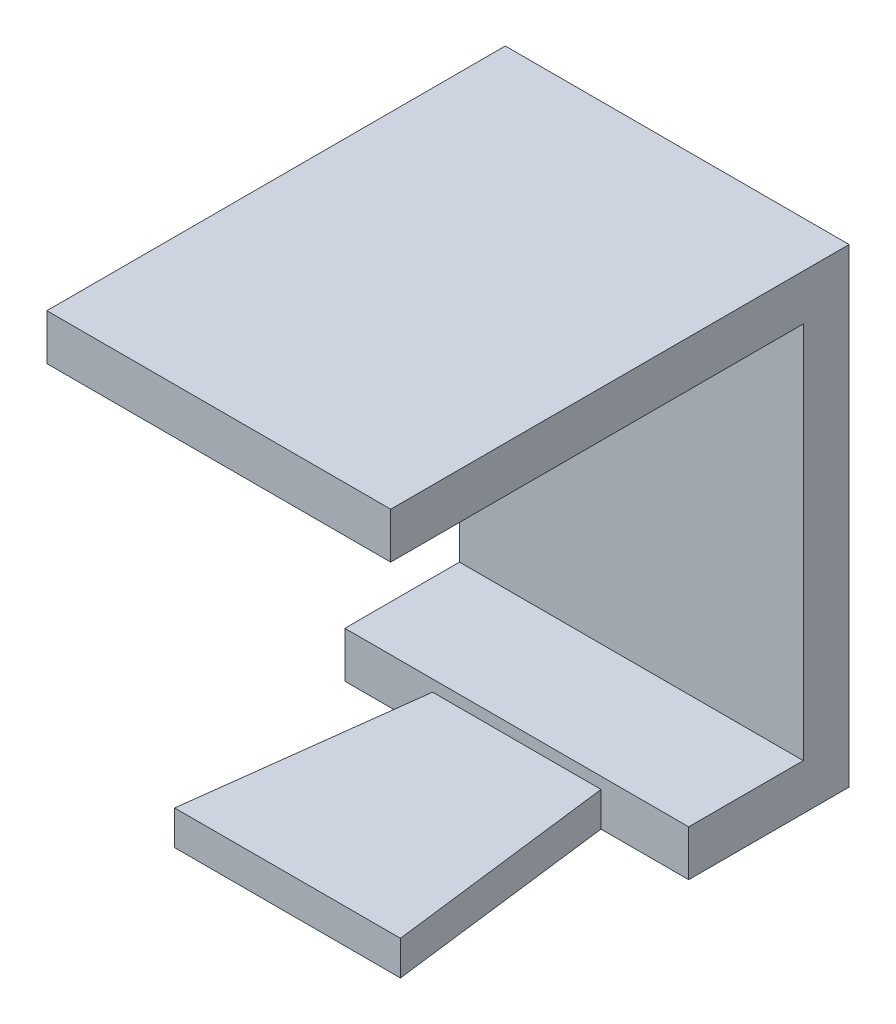
ISO-10303-21;
HEADER;
FILE_DESCRIPTION(('STEP AP214'),'2;1');
FILE_NAME('part.step','',(''),(''),'','','');
FILE_SCHEMA(('AUTOMOTIVE_DESIGN { 1 0 10303 214 1 1 1 1 }'));
ENDSEC;
DATA;
#1=APPLICATION_CONTEXT('core data for automotive mechanical design processes');
#2=APPLICATION_PROTOCOL_DEFINITION('international standard','automotive_design',2000,#1);
#3=PRODUCT_CONTEXT('',#1,'mechanical');
#4=PRODUCT('Part','Part','',(#3));
#5=PRODUCT_RELATED_PRODUCT_CATEGORY('part','',(#4));
#6=PRODUCT_DEFINITION_FORMATION('','',#4);
#7=PRODUCT_DEFINITION_CONTEXT('part definition',#1,'design');
#8=PRODUCT_DEFINITION('design','',#6,#7);
#9=PRODUCT_DEFINITION_SHAPE('','',#8);
#10=(LENGTH_UNIT() NAMED_UNIT(*) SI_UNIT(.MILLI.,.METRE.));
#11=(NAMED_UNIT(*) PLANE_ANGLE_UNIT() SI_UNIT($,.RADIAN.));
#12=(NAMED_UNIT(*) SI_UNIT($,.STERADIAN.) SOLID_ANGLE_UNIT());
#13=UNCERTAINTY_MEASURE_WITH_UNIT(LENGTH_MEASURE(1.E-05),#10,'distance_accuracy_value','');
#14=(GEOMETRIC_REPRESENTATION_CONTEXT(3) GLOBAL_UNCERTAINTY_ASSIGNED_CONTEXT((#13)) GLOBAL_UNIT_ASSIGNED_CONTEXT((#10,
#11,#12)) REPRESENTATION_CONTEXT('',''));
#15=CARTESIAN_POINT('',(0.,0.,0.));
#16=DIRECTION('',(0.,0.,1.));
#17=DIRECTION('',(1.,0.,0.));
#18=AXIS2_PLACEMENT_3D('',#15,#16,#17);
#19=CARTESIAN_POINT('',(0.,0.,4.));
#20=DIRECTION('',(1.,0.,0.));
#21=DIRECTION('',(0.,0.,-1.));
#22=AXIS2_PLACEMENT_3D('',#19,#20,#21);
#23=PLANE('',#22);
#24=DIRECTION('',(0.,-1.,0.));
#25=VECTOR('',#24,1.);
#26=CARTESIAN_POINT('',(0.,0.,0.));
#27=LINE('',#26,#25);
#28=CARTESIAN_POINT('',(0.,37.,0.));
#29=VERTEX_POINT('',#28);
#30=CARTESIAN_POINT('',(0.,-4.,0.));
#31=VERTEX_POINT('',#30);
#32=EDGE_CURVE('E213',#29,#31,#27,.T.);
#33=ORIENTED_EDGE('',*,*,#32,.T.);
#34=DIRECTION('',(0.,0.,-1.));
#35=VECTOR('',#34,1.);
#36=CARTESIAN_POINT('',(0.,-4.,0.));
#37=LINE('',#36,#35);
#38=CARTESIAN_POINT('',(0.,-4.,14.));
#39=VERTEX_POINT('',#38);
#40=EDGE_CURVE('E155',#39,#31,#37,.T.);
#41=ORIENTED_EDGE('',*,*,#40,.F.);
#42=DIRECTION('',(0.,1.,0.));
#43=VECTOR('',#42,1.);
#44=CARTESIAN_POINT('',(0.,-4.,14.));
#45=LINE('',#44,#43);
#46=CARTESIAN_POINT('',(0.,0.,14.));
#47=VERTEX_POINT('',#46);
#48=EDGE_CURVE('E167',#39,#47,#45,.T.);
#49=ORIENTED_EDGE('',*,*,#48,.T.);
#50=DIRECTION('',(0.,0.,-1.));
#51=VECTOR('',#50,1.);
#52=CARTESIAN_POINT('',(0.,0.,0.));
#53=LINE('',#52,#51);
#54=CARTESIAN_POINT('',(0.,0.,4.));
#55=VERTEX_POINT('',#54);
#56=EDGE_CURVE('E173',#47,#55,#53,.T.);
#57=ORIENTED_EDGE('',*,*,#56,.T.);
#58=DIRECTION('',(0.,-1.,0.));
#59=VECTOR('',#58,1.);
#60=CARTESIAN_POINT('',(0.,0.,4.));
#61=LINE('',#60,#59);
#62=CARTESIAN_POINT('',(0.,33.,4.));
#63=VERTEX_POINT('',#62);
#64=EDGE_CURVE('E222',#63,#55,#61,.T.);
#65=ORIENTED_EDGE('',*,*,#64,.F.);
#66=DIRECTION('',(0.,0.,1.));
#67=VECTOR('',#66,1.);
#68=CARTESIAN_POINT('',(0.,33.,0.));
#69=LINE('',#68,#67);
#70=CARTESIAN_POINT('',(0.,33.,40.));
#71=VERTEX_POINT('',#70);
#72=EDGE_CURVE('E58',#63,#71,#69,.T.);
#73=ORIENTED_EDGE('',*,*,#72,.T.);
#74=DIRECTION('',(0.,-1.,0.));
#75=VECTOR('',#74,1.);
#76=CARTESIAN_POINT('',(0.,37.,40.));
#77=LINE('',#76,#75);
#78=CARTESIAN_POINT('',(0.,37.,40.));
#79=VERTEX_POINT('',#78);
#80=EDGE_CURVE('E201',#79,#71,#77,.T.);
#81=ORIENTED_EDGE('',*,*,#80,.F.);
#82=DIRECTION('',(0.,0.,1.));
#83=VECTOR('',#82,1.);
#84=CARTESIAN_POINT('',(0.,37.,0.));
#85=LINE('',#84,#83);
#86=EDGE_CURVE('E181',#29,#79,#85,.T.);
#87=ORIENTED_EDGE('',*,*,#86,.F.);
#88=EDGE_LOOP('',(#33,#41,#49,#57,#65,#73,#81,#87));
#89=FACE_BOUND('',#88,.T.);
#90=ADVANCED_FACE('F33',(#89),#23,.F.);
#91=CARTESIAN_POINT('',(30.,0.,4.));
#92=DIRECTION('',(-1.,0.,0.));
#93=DIRECTION('',(0.,0.,1.));
#94=AXIS2_PLACEMENT_3D('',#91,#92,#93);
#95=PLANE('',#94);
#96=DIRECTION('',(0.,1.,0.));
#97=VECTOR('',#96,1.);
#98=CARTESIAN_POINT('',(30.,0.,0.));
#99=LINE('',#98,#97);
#100=CARTESIAN_POINT('',(30.,-4.,0.));
#101=VERTEX_POINT('',#100);
#102=CARTESIAN_POINT('',(30.,37.,0.));
#103=VERTEX_POINT('',#102);
#104=EDGE_CURVE('E216',#101,#103,#99,.T.);
#105=ORIENTED_EDGE('',*,*,#104,.T.);
#106=DIRECTION('',(0.,0.,-1.));
#107=VECTOR('',#106,1.);
#108=CARTESIAN_POINT('',(30.,37.,0.));
#109=LINE('',#108,#107);
#110=CARTESIAN_POINT('',(30.,37.,40.));
#111=VERTEX_POINT('',#110);
#112=EDGE_CURVE('E187',#111,#103,#109,.T.);
#113=ORIENTED_EDGE('',*,*,#112,.F.);
#114=DIRECTION('',(0.,-1.,0.));
#115=VECTOR('',#114,1.);
#116=CARTESIAN_POINT('',(30.,37.,40.));
#117=LINE('',#116,#115);
#118=CARTESIAN_POINT('',(30.,33.,40.));
#119=VERTEX_POINT('',#118);
#120=EDGE_CURVE('E193',#111,#119,#117,.T.);
#121=ORIENTED_EDGE('',*,*,#120,.T.);
#122=DIRECTION('',(0.,0.,-1.));
#123=VECTOR('',#122,1.);
#124=CARTESIAN_POINT('',(30.,33.,0.));
#125=LINE('',#124,#123);
#126=CARTESIAN_POINT('',(30.,33.,4.));
#127=VERTEX_POINT('',#126);
#128=EDGE_CURVE('E185',#119,#127,#125,.T.);
#129=ORIENTED_EDGE('',*,*,#128,.T.);
#130=DIRECTION('',(0.,1.,0.));
#131=VECTOR('',#130,1.);
#132=CARTESIAN_POINT('',(30.,0.,4.));
#133=LINE('',#132,#131);
#134=CARTESIAN_POINT('',(30.,0.,4.));
#135=VERTEX_POINT('',#134);
#136=EDGE_CURVE('E42',#135,#127,#133,.T.);
#137=ORIENTED_EDGE('',*,*,#136,.F.);
#138=DIRECTION('',(0.,0.,1.));
#139=VECTOR('',#138,1.);
#140=CARTESIAN_POINT('',(30.,0.,0.));
#141=LINE('',#140,#139);
#142=CARTESIAN_POINT('',(30.,0.,14.));
#143=VERTEX_POINT('',#142);
#144=EDGE_CURVE('E177',#135,#143,#141,.T.);
#145=ORIENTED_EDGE('',*,*,#144,.T.);
#146=DIRECTION('',(0.,1.,0.));
#147=VECTOR('',#146,1.);
#148=CARTESIAN_POINT('',(30.,-4.,14.));
#149=LINE('',#148,#147);
#150=CARTESIAN_POINT('',(30.,-4.,14.));
#151=VERTEX_POINT('',#150);
#152=EDGE_CURVE('E178',#151,#143,#149,.T.);
#153=ORIENTED_EDGE('',*,*,#152,.F.);
#154=DIRECTION('',(0.,0.,1.));
#155=VECTOR('',#154,1.);
#156=CARTESIAN_POINT('',(30.,-4.,0.));
#157=LINE('',#156,#155);
#158=EDGE_CURVE('E162',#101,#151,#157,.T.);
#159=ORIENTED_EDGE('',*,*,#158,.F.);
#160=EDGE_LOOP('',(#105,#113,#121,#129,#137,#145,#153,#159));
#161=FACE_BOUND('',#160,.T.);
#162=ADVANCED_FACE('F239',(#161),#95,.F.);
#163=CARTESIAN_POINT('',(0.,0.,4.));
#164=DIRECTION('',(0.,0.,-1.));
#165=DIRECTION('',(-1.,0.,0.));
#166=AXIS2_PLACEMENT_3D('',#163,#164,#165);
#167=PLANE('',#166);
#168=ORIENTED_EDGE('',*,*,#64,.T.);
#169=DIRECTION('',(1.,0.,0.));
#170=VECTOR('',#169,1.);
#171=CARTESIAN_POINT('',(0.,0.,4.));
#172=LINE('',#171,#170);
#173=EDGE_CURVE('E36',#55,#135,#172,.T.);
#174=ORIENTED_EDGE('',*,*,#173,.T.);
#175=ORIENTED_EDGE('',*,*,#136,.T.);
#176=DIRECTION('',(-1.,0.,0.));
#177=VECTOR('',#176,1.);
#178=CARTESIAN_POINT('',(0.,33.,4.));
#179=LINE('',#178,#177);
#180=EDGE_CURVE('E11',#127,#63,#179,.T.);
#181=ORIENTED_EDGE('',*,*,#180,.T.);
#182=EDGE_LOOP('',(#168,#174,#175,#181));
#183=FACE_BOUND('',#182,.T.);
#184=ADVANCED_FACE('F235',(#183),#167,.F.);
#185=CARTESIAN_POINT('',(0.,0.,0.));
#186=DIRECTION('',(0.,0.,-1.));
#187=DIRECTION('',(-1.,0.,0.));
#188=AXIS2_PLACEMENT_3D('',#185,#186,#187);
#189=PLANE('',#188);
#190=ORIENTED_EDGE('',*,*,#32,.F.);
#191=DIRECTION('',(-1.,0.,0.));
#192=VECTOR('',#191,1.);
#193=CARTESIAN_POINT('',(0.,37.,0.));
#194=LINE('',#193,#192);
#195=EDGE_CURVE('E190',#103,#29,#194,.T.);
#196=ORIENTED_EDGE('',*,*,#195,.F.);
#197=ORIENTED_EDGE('',*,*,#104,.F.);
#198=DIRECTION('',(1.,0.,0.));
#199=VECTOR('',#198,1.);
#200=CARTESIAN_POINT('',(0.,-4.,0.));
#201=LINE('',#200,#199);
#202=EDGE_CURVE('E158',#31,#101,#201,.T.);
#203=ORIENTED_EDGE('',*,*,#202,.F.);
#204=EDGE_LOOP('',(#190,#196,#197,#203));
#205=FACE_BOUND('',#204,.T.);
#206=ADVANCED_FACE('F251',(#205),#189,.T.);
#207=CARTESIAN_POINT('',(0.,37.,40.));
#208=DIRECTION('',(0.,0.,-1.));
#209=DIRECTION('',(-1.,0.,0.));
#210=AXIS2_PLACEMENT_3D('',#207,#208,#209);
#211=PLANE('',#210);
#212=DIRECTION('',(1.,0.,0.));
#213=VECTOR('',#212,1.);
#214=CARTESIAN_POINT('',(0.,33.,40.));
#215=LINE('',#214,#213);
#216=EDGE_CURVE('E196',#71,#119,#215,.T.);
#217=ORIENTED_EDGE('',*,*,#216,.T.);
#218=ORIENTED_EDGE('',*,*,#120,.F.);
#219=DIRECTION('',(1.,0.,0.));
#220=VECTOR('',#219,1.);
#221=CARTESIAN_POINT('',(0.,37.,40.));
#222=LINE('',#221,#220);
#223=EDGE_CURVE('E184',#79,#111,#222,.T.);
#224=ORIENTED_EDGE('',*,*,#223,.F.);
#225=ORIENTED_EDGE('',*,*,#80,.T.);
#226=EDGE_LOOP('',(#217,#218,#224,#225));
#227=FACE_BOUND('',#226,.T.);
#228=ADVANCED_FACE('F255',(#227),#211,.F.);
#229=CARTESIAN_POINT('',(0.,37.,0.));
#230=DIRECTION('',(0.,1.,0.));
#231=DIRECTION('',(0.,0.,1.));
#232=AXIS2_PLACEMENT_3D('',#229,#230,#231);
#233=PLANE('',#232);
#234=ORIENTED_EDGE('',*,*,#86,.T.);
#235=ORIENTED_EDGE('',*,*,#223,.T.);
#236=ORIENTED_EDGE('',*,*,#112,.T.);
#237=ORIENTED_EDGE('',*,*,#195,.T.);
#238=EDGE_LOOP('',(#234,#235,#236,#237));
#239=FACE_BOUND('',#238,.T.);
#240=ADVANCED_FACE('F254',(#239),#233,.T.);
#241=CARTESIAN_POINT('',(0.,33.,0.));
#242=DIRECTION('',(0.,1.,0.));
#243=DIRECTION('',(0.,0.,1.));
#244=AXIS2_PLACEMENT_3D('',#241,#242,#243);
#245=PLANE('',#244);
#246=ORIENTED_EDGE('',*,*,#180,.F.);
#247=ORIENTED_EDGE('',*,*,#128,.F.);
#248=ORIENTED_EDGE('',*,*,#216,.F.);
#249=ORIENTED_EDGE('',*,*,#72,.F.);
#250=EDGE_LOOP('',(#246,#247,#248,#249));
#251=FACE_BOUND('',#250,.T.);
#252=ADVANCED_FACE('F242',(#251),#245,.F.);
#253=CARTESIAN_POINT('',(0.,0.,0.));
#254=DIRECTION('',(0.,1.,0.));
#255=DIRECTION('',(0.,0.,1.));
#256=AXIS2_PLACEMENT_3D('',#253,#254,#255);
#257=PLANE('',#256);
#258=ORIENTED_EDGE('',*,*,#173,.F.);
#259=ORIENTED_EDGE('',*,*,#56,.F.);
#260=DIRECTION('',(-1.,0.,0.));
#261=VECTOR('',#260,1.);
#262=CARTESIAN_POINT('',(0.,0.,14.));
#263=LINE('',#262,#261);
#264=EDGE_CURVE('E159',#143,#47,#263,.T.);
#265=ORIENTED_EDGE('',*,*,#264,.F.);
#266=ORIENTED_EDGE('',*,*,#144,.F.);
#267=EDGE_LOOP('',(#258,#259,#265,#266));
#268=FACE_BOUND('',#267,.T.);
#269=ADVANCED_FACE('F245',(#268),#257,.T.);
#270=CARTESIAN_POINT('',(0.,-4.,14.));
#271=DIRECTION('',(0.,0.,-1.));
#272=DIRECTION('',(-1.,0.,0.));
#273=AXIS2_PLACEMENT_3D('',#270,#271,#272);
#274=PLANE('',#273);
#275=DIRECTION('',(-1.,0.,0.));
#276=VECTOR('',#275,1.);
#277=CARTESIAN_POINT('',(0.,-4.,14.));
#278=LINE('',#277,#276);
#279=CARTESIAN_POINT('',(7.65,-4.,14.));
#280=VERTEX_POINT('',#279);
#281=EDGE_CURVE('E146',#280,#39,#278,.T.);
#282=ORIENTED_EDGE('',*,*,#281,.F.);
#283=DIRECTION('',(0.,-1.,0.));
#284=VECTOR('',#283,1.);
#285=CARTESIAN_POINT('',(7.65,-1.,14.));
#286=LINE('',#285,#284);
#287=CARTESIAN_POINT('',(7.65,-1.,14.));
#288=VERTEX_POINT('',#287);
#289=EDGE_CURVE('E139',#288,#280,#286,.T.);
#290=ORIENTED_EDGE('',*,*,#289,.F.);
#291=DIRECTION('',(1.,0.,0.));
#292=VECTOR('',#291,1.);
#293=CARTESIAN_POINT('',(7.65,-1.,14.));
#294=LINE('',#293,#292);
#295=CARTESIAN_POINT('',(22.35,-1.,14.));
#296=VERTEX_POINT('',#295);
#297=EDGE_CURVE('E125',#288,#296,#294,.T.);
#298=ORIENTED_EDGE('',*,*,#297,.T.);
#299=DIRECTION('',(0.,-1.,0.));
#300=VECTOR('',#299,1.);
#301=CARTESIAN_POINT('',(22.35,-1.,14.));
#302=LINE('',#301,#300);
#303=CARTESIAN_POINT('',(22.35,-4.,14.));
#304=VERTEX_POINT('',#303);
#305=EDGE_CURVE('E147',#296,#304,#302,.T.);
#306=ORIENTED_EDGE('',*,*,#305,.T.);
#307=EDGE_CURVE('E164',#151,#304,#278,.T.);
#308=ORIENTED_EDGE('',*,*,#307,.F.);
#309=ORIENTED_EDGE('',*,*,#152,.T.);
#310=ORIENTED_EDGE('',*,*,#264,.T.);
#311=ORIENTED_EDGE('',*,*,#48,.F.);
#312=EDGE_LOOP('',(#282,#290,#298,#306,#308,#309,#310,#311));
#313=FACE_BOUND('',#312,.T.);
#314=ADVANCED_FACE('F144',(#313),#274,.F.);
#315=CARTESIAN_POINT('',(0.,-4.,0.));
#316=DIRECTION('',(0.,1.,0.));
#317=DIRECTION('',(0.,0.,1.));
#318=AXIS2_PLACEMENT_3D('',#315,#316,#317);
#319=PLANE('',#318);
#320=ORIENTED_EDGE('',*,*,#40,.T.);
#321=ORIENTED_EDGE('',*,*,#202,.T.);
#322=ORIENTED_EDGE('',*,*,#158,.T.);
#323=ORIENTED_EDGE('',*,*,#307,.T.);
#324=DIRECTION('',(0.124034734589208,0.,0.992277876713668));
#325=VECTOR('',#324,1.);
#326=CARTESIAN_POINT('',(22.35,-4.,14.));
#327=LINE('',#326,#325);
#328=CARTESIAN_POINT('',(24.85,-4.,34.));
#329=VERTEX_POINT('',#328);
#330=EDGE_CURVE('E389',#304,#329,#327,.T.);
#331=ORIENTED_EDGE('',*,*,#330,.T.);
#332=DIRECTION('',(-1.,0.,0.));
#333=VECTOR('',#332,1.);
#334=CARTESIAN_POINT('',(24.85,-4.,34.));
#335=LINE('',#334,#333);
#336=CARTESIAN_POINT('',(5.15,-4.,34.));
#337=VERTEX_POINT('',#336);
#338=EDGE_CURVE('E142',#329,#337,#335,.T.);
#339=ORIENTED_EDGE('',*,*,#338,.T.);
#340=DIRECTION('',(0.124034734589208,0.,-0.992277876713668));
#341=VECTOR('',#340,1.);
#342=CARTESIAN_POINT('',(5.15,-4.,34.));
#343=LINE('',#342,#341);
#344=EDGE_CURVE('E50',#337,#280,#343,.T.);
#345=ORIENTED_EDGE('',*,*,#344,.T.);
#346=ORIENTED_EDGE('',*,*,#281,.T.);
#347=EDGE_LOOP('',(#320,#321,#322,#323,#331,#339,#345,#346));
#348=FACE_BOUND('',#347,.T.);
#349=ADVANCED_FACE('F248',(#348),#319,.F.);
#350=CARTESIAN_POINT('',(5.15,-1.,34.));
#351=DIRECTION('',(-0.992277876713668,0.,-0.124034734589208));
#352=DIRECTION('',(-0.124034734589208,0.,0.992277876713668));
#353=AXIS2_PLACEMENT_3D('',#350,#351,#352);
#354=PLANE('',#353);
#355=ORIENTED_EDGE('',*,*,#344,.F.);
#356=DIRECTION('',(0.,-1.,0.));
#357=VECTOR('',#356,1.);
#358=CARTESIAN_POINT('',(5.15,-1.,34.));
#359=LINE('',#358,#357);
#360=CARTESIAN_POINT('',(5.15,-1.,34.));
#361=VERTEX_POINT('',#360);
#362=EDGE_CURVE('E141',#361,#337,#359,.T.);
#363=ORIENTED_EDGE('',*,*,#362,.F.);
#364=DIRECTION('',(0.124034734589208,0.,-0.992277876713668));
#365=VECTOR('',#364,1.);
#366=CARTESIAN_POINT('',(5.15,-1.,34.));
#367=LINE('',#366,#365);
#368=EDGE_CURVE('E129',#361,#288,#367,.T.);
#369=ORIENTED_EDGE('',*,*,#368,.T.);
#370=ORIENTED_EDGE('',*,*,#289,.T.);
#371=EDGE_LOOP('',(#355,#363,#369,#370));
#372=FACE_BOUND('',#371,.T.);
#373=ADVANCED_FACE('F138',(#372),#354,.T.);
#374=CARTESIAN_POINT('',(24.85,-1.,34.));
#375=DIRECTION('',(0.,0.,1.));
#376=DIRECTION('',(1.,0.,0.));
#377=AXIS2_PLACEMENT_3D('',#374,#375,#376);
#378=PLANE('',#377);
#379=ORIENTED_EDGE('',*,*,#338,.F.);
#380=DIRECTION('',(0.,-1.,0.));
#381=VECTOR('',#380,1.);
#382=CARTESIAN_POINT('',(24.85,-1.,34.));
#383=LINE('',#382,#381);
#384=CARTESIAN_POINT('',(24.85,-1.,34.));
#385=VERTEX_POINT('',#384);
#386=EDGE_CURVE('E150',#385,#329,#383,.T.);
#387=ORIENTED_EDGE('',*,*,#386,.F.);
#388=DIRECTION('',(-1.,0.,0.));
#389=VECTOR('',#388,1.);
#390=CARTESIAN_POINT('',(24.85,-1.,34.));
#391=LINE('',#390,#389);
#392=EDGE_CURVE('E148',#385,#361,#391,.T.);
#393=ORIENTED_EDGE('',*,*,#392,.T.);
#394=ORIENTED_EDGE('',*,*,#362,.T.);
#395=EDGE_LOOP('',(#379,#387,#393,#394));
#396=FACE_BOUND('',#395,.T.);
#397=ADVANCED_FACE('F316',(#396),#378,.T.);
#398=CARTESIAN_POINT('',(22.35,-1.,14.));
#399=DIRECTION('',(0.992277876713668,0.,-0.124034734589208));
#400=DIRECTION('',(-0.124034734589208,0.,-0.992277876713668));
#401=AXIS2_PLACEMENT_3D('',#398,#399,#400);
#402=PLANE('',#401);
#403=ORIENTED_EDGE('',*,*,#330,.F.);
#404=ORIENTED_EDGE('',*,*,#305,.F.);
#405=DIRECTION('',(0.124034734589208,0.,0.992277876713668));
#406=VECTOR('',#405,1.);
#407=CARTESIAN_POINT('',(22.35,-1.,14.));
#408=LINE('',#407,#406);
#409=EDGE_CURVE('E132',#296,#385,#408,.T.);
#410=ORIENTED_EDGE('',*,*,#409,.T.);
#411=ORIENTED_EDGE('',*,*,#386,.T.);
#412=EDGE_LOOP('',(#403,#404,#410,#411));
#413=FACE_BOUND('',#412,.T.);
#414=ADVANCED_FACE('F325',(#413),#402,.T.);
#415=CARTESIAN_POINT('',(0.,-0.999999999999998,0.));
#416=DIRECTION('',(0.,-1.,0.));
#417=DIRECTION('',(0.,0.,-1.));
#418=AXIS2_PLACEMENT_3D('',#415,#416,#417);
#419=PLANE('',#418);
#420=ORIENTED_EDGE('',*,*,#368,.F.);
#421=ORIENTED_EDGE('',*,*,#392,.F.);
#422=ORIENTED_EDGE('',*,*,#409,.F.);
#423=ORIENTED_EDGE('',*,*,#297,.F.);
#424=EDGE_LOOP('',(#420,#421,#422,#423));
#425=FACE_BOUND('',#424,.T.);
#426=ADVANCED_FACE('F127',(#425),#419,.F.);
#427=CLOSED_SHELL('',(#90,#162,#184,#206,#228,#240,#252,#269,#314,#349,#373,#397,#414,#426));
#428=MANIFOLD_SOLID_BREP('B2',#427);
#429=ADVANCED_BREP_SHAPE_REPRESENTATION('',(#18,#428),#14);
#430=SHAPE_DEFINITION_REPRESENTATION(#9,#429);
ENDSEC;
END-ISO-10303-21;
